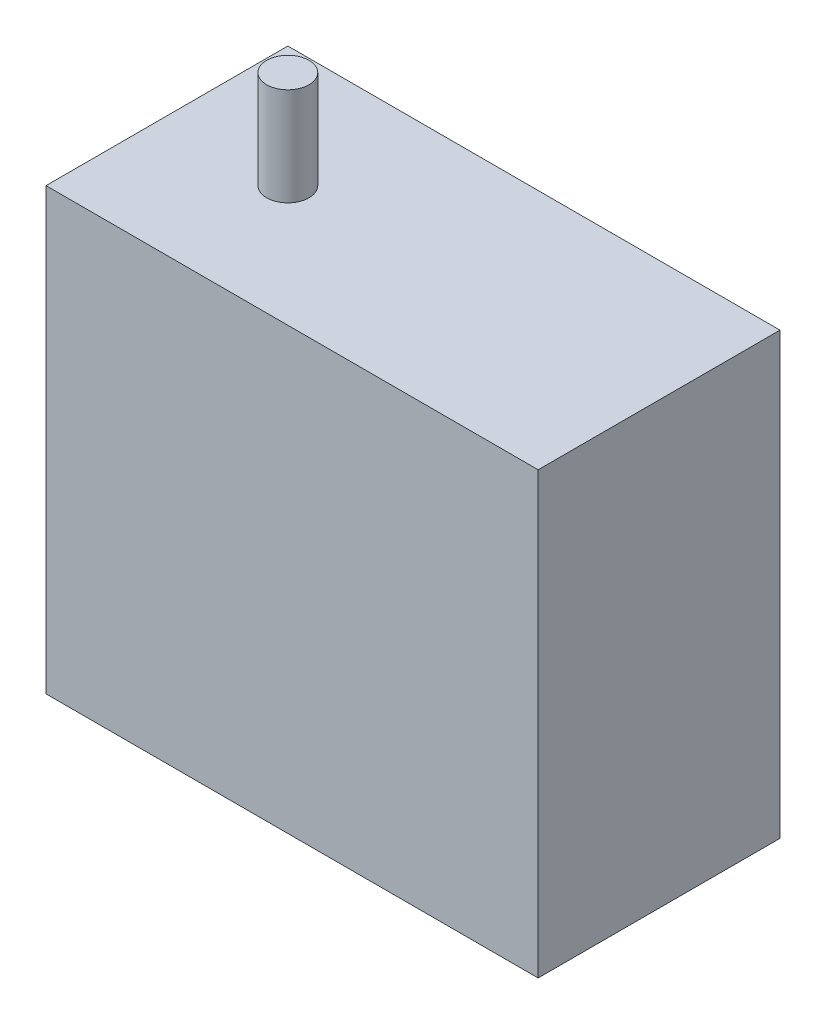
ISO-10303-21;
HEADER;
FILE_DESCRIPTION(('STEP AP214'),'2;1');
FILE_NAME('part.step','',(''),(''),'','','');
FILE_SCHEMA(('AUTOMOTIVE_DESIGN { 1 0 10303 214 1 1 1 1 }'));
ENDSEC;
DATA;
#1=APPLICATION_CONTEXT('core data for automotive mechanical design processes');
#2=APPLICATION_PROTOCOL_DEFINITION('international standard','automotive_design',2000,#1);
#3=PRODUCT_CONTEXT('',#1,'mechanical');
#4=PRODUCT('Part','Part','',(#3));
#5=PRODUCT_RELATED_PRODUCT_CATEGORY('part','',(#4));
#6=PRODUCT_DEFINITION_FORMATION('','',#4);
#7=PRODUCT_DEFINITION_CONTEXT('part definition',#1,'design');
#8=PRODUCT_DEFINITION('design','',#6,#7);
#9=PRODUCT_DEFINITION_SHAPE('','',#8);
#10=(LENGTH_UNIT() NAMED_UNIT(*) SI_UNIT(.MILLI.,.METRE.));
#11=(NAMED_UNIT(*) PLANE_ANGLE_UNIT() SI_UNIT($,.RADIAN.));
#12=(NAMED_UNIT(*) SI_UNIT($,.STERADIAN.) SOLID_ANGLE_UNIT());
#13=UNCERTAINTY_MEASURE_WITH_UNIT(LENGTH_MEASURE(1.E-05),#10,'distance_accuracy_value','');
#14=(GEOMETRIC_REPRESENTATION_CONTEXT(3) GLOBAL_UNCERTAINTY_ASSIGNED_CONTEXT((#13)) GLOBAL_UNIT_ASSIGNED_CONTEXT((#10,
#11,#12)) REPRESENTATION_CONTEXT('',''));
#15=CARTESIAN_POINT('',(0.,0.,0.));
#16=DIRECTION('',(0.,0.,1.));
#17=DIRECTION('',(1.,0.,0.));
#18=AXIS2_PLACEMENT_3D('',#15,#16,#17);
#19=CARTESIAN_POINT('',(0.,36.4,0.));
#20=DIRECTION('',(0.,1.,0.));
#21=DIRECTION('',(0.,0.,1.));
#22=AXIS2_PLACEMENT_3D('',#19,#20,#21);
#23=PLANE('',#22);
#24=DIRECTION('',(0.,0.,-1.));
#25=VECTOR('',#24,1.);
#26=CARTESIAN_POINT('',(20.35,36.4,-10.));
#27=LINE('',#26,#25);
#28=CARTESIAN_POINT('',(20.35,36.4,10.));
#29=VERTEX_POINT('',#28);
#30=CARTESIAN_POINT('',(20.35,36.4,-10.));
#31=VERTEX_POINT('',#30);
#32=EDGE_CURVE('E85',#29,#31,#27,.T.);
#33=ORIENTED_EDGE('',*,*,#32,.T.);
#34=DIRECTION('',(-1.,0.,0.));
#35=VECTOR('',#34,1.);
#36=CARTESIAN_POINT('',(-20.35,36.4,-10.));
#37=LINE('',#36,#35);
#38=CARTESIAN_POINT('',(-20.35,36.4,-10.));
#39=VERTEX_POINT('',#38);
#40=EDGE_CURVE('E80',#31,#39,#37,.T.);
#41=ORIENTED_EDGE('',*,*,#40,.T.);
#42=DIRECTION('',(0.,0.,1.));
#43=VECTOR('',#42,1.);
#44=CARTESIAN_POINT('',(-20.35,36.4,-10.));
#45=LINE('',#44,#43);
#46=CARTESIAN_POINT('',(-20.35,36.4,10.));
#47=VERTEX_POINT('',#46);
#48=EDGE_CURVE('E83',#39,#47,#45,.T.);
#49=ORIENTED_EDGE('',*,*,#48,.T.);
#50=DIRECTION('',(1.,0.,0.));
#51=VECTOR('',#50,1.);
#52=CARTESIAN_POINT('',(-20.35,36.4,10.));
#53=LINE('',#52,#51);
#54=EDGE_CURVE('E50',#47,#29,#53,.T.);
#55=ORIENTED_EDGE('',*,*,#54,.T.);
#56=EDGE_LOOP('',(#33,#41,#49,#55));
#57=FACE_BOUND('',#56,.T.);
#58=CARTESIAN_POINT('',(-10.35,36.4,0.));
#59=DIRECTION('',(0.,1.,0.));
#60=DIRECTION('',(0.,0.,1.));
#61=AXIS2_PLACEMENT_3D('',#58,#59,#60);
#62=CIRCLE('',#61,1.75);
#63=CARTESIAN_POINT('',(-10.35,36.4,1.75));
#64=VERTEX_POINT('',#63);
#65=EDGE_CURVE('E111',#64,#64,#62,.T.);
#66=ORIENTED_EDGE('',*,*,#65,.F.);
#67=EDGE_LOOP('',(#66));
#68=FACE_BOUND('',#67,.T.);
#69=ADVANCED_FACE('F33',(#57,#68),#23,.T.);
#70=CARTESIAN_POINT('',(20.35,36.4,-10.));
#71=DIRECTION('',(-1.,0.,0.));
#72=DIRECTION('',(0.,0.,1.));
#73=AXIS2_PLACEMENT_3D('',#70,#71,#72);
#74=PLANE('',#73);
#75=DIRECTION('',(0.,0.,-1.));
#76=VECTOR('',#75,1.);
#77=CARTESIAN_POINT('',(20.35,0.,-10.));
#78=LINE('',#77,#76);
#79=CARTESIAN_POINT('',(20.35,0.,10.));
#80=VERTEX_POINT('',#79);
#81=CARTESIAN_POINT('',(20.35,0.,-10.));
#82=VERTEX_POINT('',#81);
#83=EDGE_CURVE('E97',#80,#82,#78,.T.);
#84=ORIENTED_EDGE('',*,*,#83,.T.);
#85=DIRECTION('',(0.,-1.,0.));
#86=VECTOR('',#85,1.);
#87=CARTESIAN_POINT('',(20.35,36.4,-10.));
#88=LINE('',#87,#86);
#89=EDGE_CURVE('E11',#31,#82,#88,.T.);
#90=ORIENTED_EDGE('',*,*,#89,.F.);
#91=ORIENTED_EDGE('',*,*,#32,.F.);
#92=DIRECTION('',(0.,-1.,0.));
#93=VECTOR('',#92,1.);
#94=CARTESIAN_POINT('',(20.35,36.4,10.));
#95=LINE('',#94,#93);
#96=EDGE_CURVE('E93',#29,#80,#95,.T.);
#97=ORIENTED_EDGE('',*,*,#96,.T.);
#98=EDGE_LOOP('',(#84,#90,#91,#97));
#99=FACE_BOUND('',#98,.T.);
#100=ADVANCED_FACE('F35',(#99),#74,.F.);
#101=CARTESIAN_POINT('',(-20.35,36.4,-10.));
#102=DIRECTION('',(0.,0.,1.));
#103=DIRECTION('',(1.,0.,0.));
#104=AXIS2_PLACEMENT_3D('',#101,#102,#103);
#105=PLANE('',#104);
#106=DIRECTION('',(-1.,0.,0.));
#107=VECTOR('',#106,1.);
#108=CARTESIAN_POINT('',(-20.35,0.,-10.));
#109=LINE('',#108,#107);
#110=CARTESIAN_POINT('',(-20.35,0.,-10.));
#111=VERTEX_POINT('',#110);
#112=EDGE_CURVE('E89',#82,#111,#109,.T.);
#113=ORIENTED_EDGE('',*,*,#112,.T.);
#114=DIRECTION('',(0.,-1.,0.));
#115=VECTOR('',#114,1.);
#116=CARTESIAN_POINT('',(-20.35,36.4,-10.));
#117=LINE('',#116,#115);
#118=EDGE_CURVE('E42',#39,#111,#117,.T.);
#119=ORIENTED_EDGE('',*,*,#118,.F.);
#120=ORIENTED_EDGE('',*,*,#40,.F.);
#121=ORIENTED_EDGE('',*,*,#89,.T.);
#122=EDGE_LOOP('',(#113,#119,#120,#121));
#123=FACE_BOUND('',#122,.T.);
#124=ADVANCED_FACE('F88',(#123),#105,.F.);
#125=CARTESIAN_POINT('',(-20.35,36.4,-10.));
#126=DIRECTION('',(1.,0.,0.));
#127=DIRECTION('',(0.,0.,-1.));
#128=AXIS2_PLACEMENT_3D('',#125,#126,#127);
#129=PLANE('',#128);
#130=DIRECTION('',(0.,0.,1.));
#131=VECTOR('',#130,1.);
#132=CARTESIAN_POINT('',(-20.35,0.,-10.));
#133=LINE('',#132,#131);
#134=CARTESIAN_POINT('',(-20.35,0.,10.));
#135=VERTEX_POINT('',#134);
#136=EDGE_CURVE('E67',#111,#135,#133,.T.);
#137=ORIENTED_EDGE('',*,*,#136,.T.);
#138=DIRECTION('',(0.,-1.,0.));
#139=VECTOR('',#138,1.);
#140=CARTESIAN_POINT('',(-20.35,36.4,10.));
#141=LINE('',#140,#139);
#142=EDGE_CURVE('E90',#47,#135,#141,.T.);
#143=ORIENTED_EDGE('',*,*,#142,.F.);
#144=ORIENTED_EDGE('',*,*,#48,.F.);
#145=ORIENTED_EDGE('',*,*,#118,.T.);
#146=EDGE_LOOP('',(#137,#143,#144,#145));
#147=FACE_BOUND('',#146,.T.);
#148=ADVANCED_FACE('F91',(#147),#129,.F.);
#149=CARTESIAN_POINT('',(-20.35,36.4,10.));
#150=DIRECTION('',(0.,0.,-1.));
#151=DIRECTION('',(-1.,0.,0.));
#152=AXIS2_PLACEMENT_3D('',#149,#150,#151);
#153=PLANE('',#152);
#154=DIRECTION('',(1.,0.,0.));
#155=VECTOR('',#154,1.);
#156=CARTESIAN_POINT('',(-20.35,0.,10.));
#157=LINE('',#156,#155);
#158=EDGE_CURVE('E73',#135,#80,#157,.T.);
#159=ORIENTED_EDGE('',*,*,#158,.T.);
#160=ORIENTED_EDGE('',*,*,#96,.F.);
#161=ORIENTED_EDGE('',*,*,#54,.F.);
#162=ORIENTED_EDGE('',*,*,#142,.T.);
#163=EDGE_LOOP('',(#159,#160,#161,#162));
#164=FACE_BOUND('',#163,.T.);
#165=ADVANCED_FACE('F105',(#164),#153,.F.);
#166=CARTESIAN_POINT('',(0.,0.,0.));
#167=DIRECTION('',(0.,1.,0.));
#168=DIRECTION('',(0.,0.,1.));
#169=AXIS2_PLACEMENT_3D('',#166,#167,#168);
#170=PLANE('',#169);
#171=ORIENTED_EDGE('',*,*,#83,.F.);
#172=ORIENTED_EDGE('',*,*,#158,.F.);
#173=ORIENTED_EDGE('',*,*,#136,.F.);
#174=ORIENTED_EDGE('',*,*,#112,.F.);
#175=EDGE_LOOP('',(#171,#172,#173,#174));
#176=FACE_BOUND('',#175,.T.);
#177=ADVANCED_FACE('F108',(#176),#170,.F.);
#178=CARTESIAN_POINT('',(-10.35,44.5,0.));
#179=DIRECTION('',(0.,-1.,0.));
#180=DIRECTION('',(0.,0.,-1.));
#181=AXIS2_PLACEMENT_3D('',#178,#179,#180);
#182=CYLINDRICAL_SURFACE('',#181,1.75);
#183=CARTESIAN_POINT('',(-10.35,44.5,0.));
#184=DIRECTION('',(0.,1.,0.));
#185=DIRECTION('',(0.,0.,1.));
#186=AXIS2_PLACEMENT_3D('',#183,#184,#185);
#187=CIRCLE('',#186,1.75);
#188=CARTESIAN_POINT('',(-10.35,44.5,1.75));
#189=VERTEX_POINT('',#188);
#190=EDGE_CURVE('E100',#189,#189,#187,.T.);
#191=ORIENTED_EDGE('',*,*,#190,.F.);
#192=EDGE_LOOP('',(#191));
#193=FACE_BOUND('',#192,.T.);
#194=ORIENTED_EDGE('',*,*,#65,.T.);
#195=EDGE_LOOP('',(#194));
#196=FACE_BOUND('',#195,.T.);
#197=ADVANCED_FACE('F119',(#193,#196),#182,.T.);
#198=CARTESIAN_POINT('',(-10.35,44.5,0.));
#199=DIRECTION('',(0.,1.,0.));
#200=DIRECTION('',(0.,0.,1.));
#201=AXIS2_PLACEMENT_3D('',#198,#199,#200);
#202=PLANE('',#201);
#203=ORIENTED_EDGE('',*,*,#190,.T.);
#204=EDGE_LOOP('',(#203));
#205=FACE_BOUND('',#204,.T.);
#206=ADVANCED_FACE('F117',(#205),#202,.T.);
#207=CLOSED_SHELL('',(#69,#100,#124,#148,#165,#177,#197,#206));
#208=MANIFOLD_SOLID_BREP('B2',#207);
#209=ADVANCED_BREP_SHAPE_REPRESENTATION('',(#18,#208),#14);
#210=SHAPE_DEFINITION_REPRESENTATION(#9,#209);
ENDSEC;
END-ISO-10303-21;
